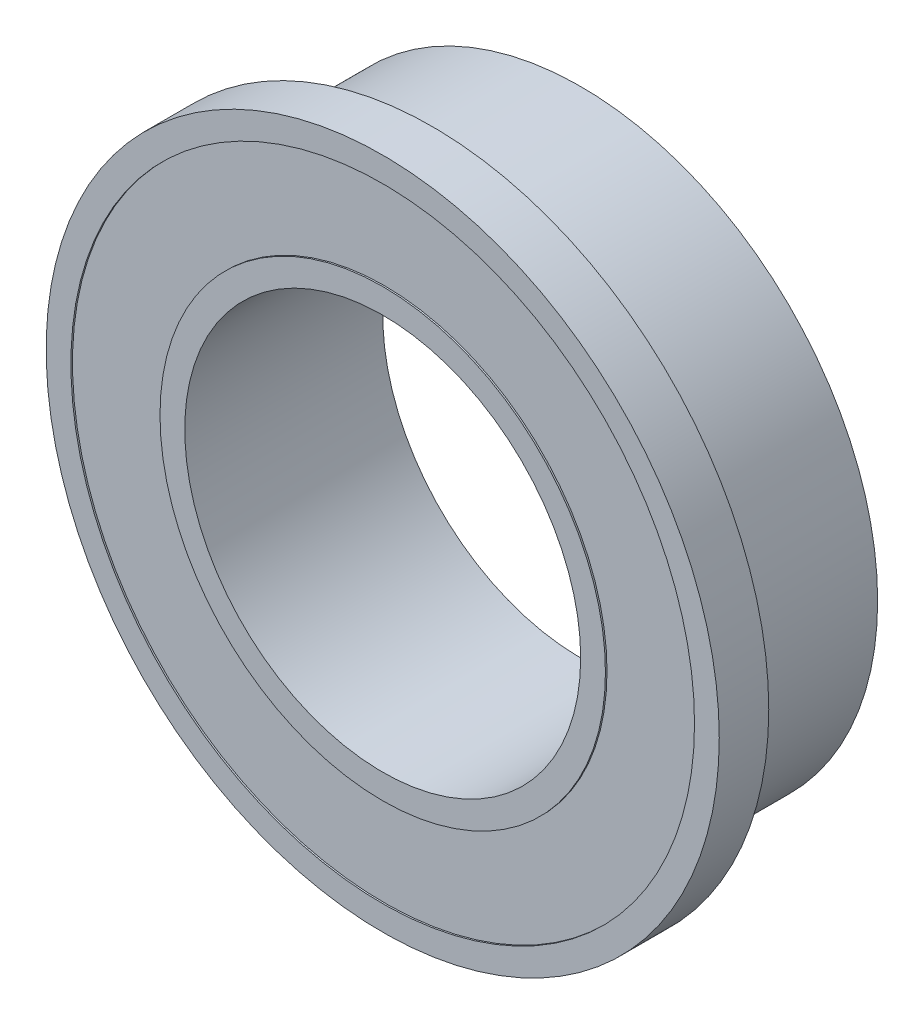
ISO-10303-21;
HEADER;
FILE_DESCRIPTION(('STEP AP214'),'2;1');
FILE_NAME('part.step','',(''),(''),'','','');
FILE_SCHEMA(('AUTOMOTIVE_DESIGN { 1 0 10303 214 1 1 1 1 }'));
ENDSEC;
DATA;
#1=APPLICATION_CONTEXT('core data for automotive mechanical design processes');
#2=APPLICATION_PROTOCOL_DEFINITION('international standard','automotive_design',2000,#1);
#3=PRODUCT_CONTEXT('',#1,'mechanical');
#4=PRODUCT('Part','Part','',(#3));
#5=PRODUCT_RELATED_PRODUCT_CATEGORY('part','',(#4));
#6=PRODUCT_DEFINITION_FORMATION('','',#4);
#7=PRODUCT_DEFINITION_CONTEXT('part definition',#1,'design');
#8=PRODUCT_DEFINITION('design','',#6,#7);
#9=PRODUCT_DEFINITION_SHAPE('','',#8);
#10=(LENGTH_UNIT() NAMED_UNIT(*) SI_UNIT(.MILLI.,.METRE.));
#11=(NAMED_UNIT(*) PLANE_ANGLE_UNIT() SI_UNIT($,.RADIAN.));
#12=(NAMED_UNIT(*) SI_UNIT($,.STERADIAN.) SOLID_ANGLE_UNIT());
#13=UNCERTAINTY_MEASURE_WITH_UNIT(LENGTH_MEASURE(1.E-05),#10,'distance_accuracy_value','');
#14=(GEOMETRIC_REPRESENTATION_CONTEXT(3) GLOBAL_UNCERTAINTY_ASSIGNED_CONTEXT((#13)) GLOBAL_UNIT_ASSIGNED_CONTEXT((#10,
#11,#12)) REPRESENTATION_CONTEXT('',''));
#15=CARTESIAN_POINT('',(0.,0.,0.));
#16=DIRECTION('',(0.,0.,1.));
#17=DIRECTION('',(1.,0.,0.));
#18=AXIS2_PLACEMENT_3D('',#15,#16,#17);
#19=CARTESIAN_POINT('',(0.,0.,0.));
#20=DIRECTION('',(0.,0.,1.));
#21=DIRECTION('',(1.,0.,0.));
#22=AXIS2_PLACEMENT_3D('',#19,#20,#21);
#23=PLANE('',#22);
#24=CARTESIAN_POINT('',(0.,0.,0.));
#25=DIRECTION('',(0.,0.,1.));
#26=DIRECTION('',(1.,0.,0.));
#27=AXIS2_PLACEMENT_3D('',#24,#25,#26);
#28=CIRCLE('',#27,3.175);
#29=CARTESIAN_POINT('',(3.175,0.,0.));
#30=VERTEX_POINT('',#29);
#31=EDGE_CURVE('E58',#30,#30,#28,.T.);
#32=ORIENTED_EDGE('',*,*,#31,.T.);
#33=EDGE_LOOP('',(#32));
#34=FACE_BOUND('',#33,.T.);
#35=CARTESIAN_POINT('',(0.,0.,0.));
#36=DIRECTION('',(0.,0.,-1.));
#37=DIRECTION('',(-1.,0.,0.));
#38=AXIS2_PLACEMENT_3D('',#35,#36,#37);
#39=CIRCLE('',#38,3.571875);
#40=CARTESIAN_POINT('',(-3.571875,0.,0.));
#41=VERTEX_POINT('',#40);
#42=EDGE_CURVE('E89',#41,#41,#39,.T.);
#43=ORIENTED_EDGE('',*,*,#42,.T.);
#44=EDGE_LOOP('',(#43));
#45=FACE_BOUND('',#44,.T.);
#46=ADVANCED_FACE('F44',(#34,#45),#23,.F.);
#47=CARTESIAN_POINT('',(0.,0.,3.175));
#48=DIRECTION('',(0.,0.,1.));
#49=DIRECTION('',(1.,0.,0.));
#50=AXIS2_PLACEMENT_3D('',#47,#48,#49);
#51=PLANE('',#50);
#52=CARTESIAN_POINT('',(0.,0.,3.175));
#53=DIRECTION('',(0.,0.,1.));
#54=DIRECTION('',(1.,0.,0.));
#55=AXIS2_PLACEMENT_3D('',#52,#53,#54);
#56=CIRCLE('',#55,3.175);
#57=CARTESIAN_POINT('',(3.175,0.,3.175));
#58=VERTEX_POINT('',#57);
#59=EDGE_CURVE('E57',#58,#58,#56,.T.);
#60=ORIENTED_EDGE('',*,*,#59,.F.);
#61=EDGE_LOOP('',(#60));
#62=FACE_BOUND('',#61,.T.);
#63=CARTESIAN_POINT('',(0.,0.,3.175));
#64=DIRECTION('',(0.,0.,1.));
#65=DIRECTION('',(1.,0.,0.));
#66=AXIS2_PLACEMENT_3D('',#63,#64,#65);
#67=CIRCLE('',#66,3.571875);
#68=CARTESIAN_POINT('',(3.571875,0.,3.175));
#69=VERTEX_POINT('',#68);
#70=EDGE_CURVE('E80',#69,#69,#67,.T.);
#71=ORIENTED_EDGE('',*,*,#70,.T.);
#72=EDGE_LOOP('',(#71));
#73=FACE_BOUND('',#72,.T.);
#74=ADVANCED_FACE('F130',(#62,#73),#51,.T.);
#75=CARTESIAN_POINT('',(0.,0.,3.175));
#76=DIRECTION('',(0.,0.,-1.));
#77=DIRECTION('',(-1.,0.,0.));
#78=AXIS2_PLACEMENT_3D('',#75,#76,#77);
#79=CYLINDRICAL_SURFACE('',#78,4.7625);
#80=CARTESIAN_POINT('',(0.,0.,0.));
#81=DIRECTION('',(0.,0.,1.));
#82=DIRECTION('',(1.,0.,0.));
#83=AXIS2_PLACEMENT_3D('',#80,#81,#82);
#84=CIRCLE('',#83,4.7625);
#85=CARTESIAN_POINT('',(4.7625,0.,0.));
#86=VERTEX_POINT('',#85);
#87=EDGE_CURVE('E55',#86,#86,#84,.T.);
#88=ORIENTED_EDGE('',*,*,#87,.T.);
#89=EDGE_LOOP('',(#88));
#90=FACE_BOUND('',#89,.T.);
#91=CARTESIAN_POINT('',(0.,0.,2.38125));
#92=DIRECTION('',(0.,0.,1.));
#93=DIRECTION('',(1.,0.,0.));
#94=AXIS2_PLACEMENT_3D('',#91,#92,#93);
#95=CIRCLE('',#94,4.7625);
#96=CARTESIAN_POINT('',(4.7625,0.,2.38125));
#97=VERTEX_POINT('',#96);
#98=EDGE_CURVE('E10',#97,#97,#95,.T.);
#99=ORIENTED_EDGE('',*,*,#98,.F.);
#100=EDGE_LOOP('',(#99));
#101=FACE_BOUND('',#100,.T.);
#102=ADVANCED_FACE('F50',(#90,#101),#79,.T.);
#103=CARTESIAN_POINT('',(0.,0.,3.175));
#104=DIRECTION('',(0.,0.,1.));
#105=DIRECTION('',(1.,0.,0.));
#106=AXIS2_PLACEMENT_3D('',#103,#104,#105);
#107=CIRCLE('',#106,5.000625);
#108=CARTESIAN_POINT('',(5.000625,0.,3.175));
#109=VERTEX_POINT('',#108);
#110=EDGE_CURVE('E75',#109,#109,#107,.T.);
#111=ORIENTED_EDGE('',*,*,#110,.F.);
#112=EDGE_LOOP('',(#111));
#113=FACE_BOUND('',#112,.T.);
#114=CARTESIAN_POINT('',(0.,0.,3.175));
#115=DIRECTION('',(0.,0.,1.));
#116=DIRECTION('',(1.,0.,0.));
#117=AXIS2_PLACEMENT_3D('',#114,#115,#116);
#118=CIRCLE('',#117,5.3975);
#119=CARTESIAN_POINT('',(5.3975,0.,3.175));
#120=VERTEX_POINT('',#119);
#121=EDGE_CURVE('E67',#120,#120,#118,.T.);
#122=ORIENTED_EDGE('',*,*,#121,.T.);
#123=EDGE_LOOP('',(#122));
#124=FACE_BOUND('',#123,.T.);
#125=ADVANCED_FACE('F119',(#113,#124),#51,.T.);
#126=CARTESIAN_POINT('',(0.,0.,0.));
#127=DIRECTION('',(0.,0.,-1.));
#128=DIRECTION('',(-1.,0.,0.));
#129=AXIS2_PLACEMENT_3D('',#126,#127,#128);
#130=CIRCLE('',#129,4.365625);
#131=CARTESIAN_POINT('',(-4.365625,0.,0.));
#132=VERTEX_POINT('',#131);
#133=EDGE_CURVE('E81',#132,#132,#130,.T.);
#134=ORIENTED_EDGE('',*,*,#133,.F.);
#135=EDGE_LOOP('',(#134));
#136=FACE_BOUND('',#135,.T.);
#137=ORIENTED_EDGE('',*,*,#87,.F.);
#138=EDGE_LOOP('',(#137));
#139=FACE_BOUND('',#138,.T.);
#140=ADVANCED_FACE('F115',(#136,#139),#23,.F.);
#141=CARTESIAN_POINT('',(0.,0.,3.175));
#142=DIRECTION('',(0.,0.,-1.));
#143=DIRECTION('',(-1.,0.,0.));
#144=AXIS2_PLACEMENT_3D('',#141,#142,#143);
#145=CYLINDRICAL_SURFACE('',#144,3.175);
#146=ORIENTED_EDGE('',*,*,#59,.T.);
#147=EDGE_LOOP('',(#146));
#148=FACE_BOUND('',#147,.T.);
#149=ORIENTED_EDGE('',*,*,#31,.F.);
#150=EDGE_LOOP('',(#149));
#151=FACE_BOUND('',#150,.T.);
#152=ADVANCED_FACE('F113',(#148,#151),#145,.F.);
#153=CARTESIAN_POINT('',(0.,0.,2.38125));
#154=DIRECTION('',(0.,0.,1.));
#155=DIRECTION('',(1.,0.,0.));
#156=AXIS2_PLACEMENT_3D('',#153,#154,#155);
#157=CYLINDRICAL_SURFACE('',#156,5.3975);
#158=CARTESIAN_POINT('',(0.,0.,2.38125));
#159=DIRECTION('',(0.,0.,1.));
#160=DIRECTION('',(1.,0.,0.));
#161=AXIS2_PLACEMENT_3D('',#158,#159,#160);
#162=CIRCLE('',#161,5.3975);
#163=CARTESIAN_POINT('',(5.3975,0.,2.38125));
#164=VERTEX_POINT('',#163);
#165=EDGE_CURVE('E63',#164,#164,#162,.T.);
#166=ORIENTED_EDGE('',*,*,#165,.T.);
#167=EDGE_LOOP('',(#166));
#168=FACE_BOUND('',#167,.T.);
#169=ORIENTED_EDGE('',*,*,#121,.F.);
#170=EDGE_LOOP('',(#169));
#171=FACE_BOUND('',#170,.T.);
#172=ADVANCED_FACE('F122',(#168,#171),#157,.T.);
#173=CARTESIAN_POINT('',(0.,0.,2.38125));
#174=DIRECTION('',(0.,0.,1.));
#175=DIRECTION('',(1.,0.,0.));
#176=AXIS2_PLACEMENT_3D('',#173,#174,#175);
#177=PLANE('',#176);
#178=ORIENTED_EDGE('',*,*,#98,.T.);
#179=EDGE_LOOP('',(#178));
#180=FACE_BOUND('',#179,.T.);
#181=ORIENTED_EDGE('',*,*,#165,.F.);
#182=EDGE_LOOP('',(#181));
#183=FACE_BOUND('',#182,.T.);
#184=ADVANCED_FACE('F155',(#180,#183),#177,.F.);
#185=CARTESIAN_POINT('',(0.,0.,3.1496));
#186=DIRECTION('',(0.,0.,1.));
#187=DIRECTION('',(1.,0.,0.));
#188=AXIS2_PLACEMENT_3D('',#185,#186,#187);
#189=CYLINDRICAL_SURFACE('',#188,5.000625);
#190=CARTESIAN_POINT('',(0.,0.,3.1496));
#191=DIRECTION('',(0.,0.,1.));
#192=DIRECTION('',(1.,0.,0.));
#193=AXIS2_PLACEMENT_3D('',#190,#191,#192);
#194=CIRCLE('',#193,5.000625);
#195=CARTESIAN_POINT('',(5.000625,0.,3.1496));
#196=VERTEX_POINT('',#195);
#197=EDGE_CURVE('E66',#196,#196,#194,.T.);
#198=ORIENTED_EDGE('',*,*,#197,.F.);
#199=EDGE_LOOP('',(#198));
#200=FACE_BOUND('',#199,.T.);
#201=ORIENTED_EDGE('',*,*,#110,.T.);
#202=EDGE_LOOP('',(#201));
#203=FACE_BOUND('',#202,.T.);
#204=ADVANCED_FACE('F146',(#200,#203),#189,.F.);
#205=CARTESIAN_POINT('',(0.,0.,3.1496));
#206=DIRECTION('',(0.,0.,1.));
#207=DIRECTION('',(1.,0.,0.));
#208=AXIS2_PLACEMENT_3D('',#205,#206,#207);
#209=PLANE('',#208);
#210=CARTESIAN_POINT('',(0.,0.,3.1496));
#211=DIRECTION('',(0.,0.,1.));
#212=DIRECTION('',(1.,0.,0.));
#213=AXIS2_PLACEMENT_3D('',#210,#211,#212);
#214=CIRCLE('',#213,3.571875);
#215=CARTESIAN_POINT('',(3.571875,0.,3.1496));
#216=VERTEX_POINT('',#215);
#217=EDGE_CURVE('E73',#216,#216,#214,.T.);
#218=ORIENTED_EDGE('',*,*,#217,.F.);
#219=EDGE_LOOP('',(#218));
#220=FACE_BOUND('',#219,.T.);
#221=ORIENTED_EDGE('',*,*,#197,.T.);
#222=EDGE_LOOP('',(#221));
#223=FACE_BOUND('',#222,.T.);
#224=ADVANCED_FACE('F145',(#220,#223),#209,.T.);
#225=CARTESIAN_POINT('',(0.,0.,3.1496));
#226=DIRECTION('',(0.,0.,1.));
#227=DIRECTION('',(1.,0.,0.));
#228=AXIS2_PLACEMENT_3D('',#225,#226,#227);
#229=CYLINDRICAL_SURFACE('',#228,3.571875);
#230=ORIENTED_EDGE('',*,*,#217,.T.);
#231=EDGE_LOOP('',(#230));
#232=FACE_BOUND('',#231,.T.);
#233=ORIENTED_EDGE('',*,*,#70,.F.);
#234=EDGE_LOOP('',(#233));
#235=FACE_BOUND('',#234,.T.);
#236=ADVANCED_FACE('F107',(#232,#235),#229,.T.);
#237=CARTESIAN_POINT('',(0.,0.,0.0254));
#238=DIRECTION('',(0.,0.,-1.));
#239=DIRECTION('',(-1.,0.,0.));
#240=AXIS2_PLACEMENT_3D('',#237,#238,#239);
#241=CYLINDRICAL_SURFACE('',#240,4.365625);
#242=CARTESIAN_POINT('',(0.,0.,0.0254));
#243=DIRECTION('',(0.,0.,-1.));
#244=DIRECTION('',(-1.,0.,0.));
#245=AXIS2_PLACEMENT_3D('',#242,#243,#244);
#246=CIRCLE('',#245,4.365625);
#247=CARTESIAN_POINT('',(-4.365625,0.,0.0254));
#248=VERTEX_POINT('',#247);
#249=EDGE_CURVE('E82',#248,#248,#246,.T.);
#250=ORIENTED_EDGE('',*,*,#249,.F.);
#251=EDGE_LOOP('',(#250));
#252=FACE_BOUND('',#251,.T.);
#253=ORIENTED_EDGE('',*,*,#133,.T.);
#254=EDGE_LOOP('',(#253));
#255=FACE_BOUND('',#254,.T.);
#256=ADVANCED_FACE('F105',(#252,#255),#241,.F.);
#257=CARTESIAN_POINT('',(0.,0.,0.0254));
#258=DIRECTION('',(0.,0.,-1.));
#259=DIRECTION('',(-1.,0.,0.));
#260=AXIS2_PLACEMENT_3D('',#257,#258,#259);
#261=PLANE('',#260);
#262=CARTESIAN_POINT('',(0.,0.,0.0254));
#263=DIRECTION('',(0.,0.,-1.));
#264=DIRECTION('',(-1.,0.,0.));
#265=AXIS2_PLACEMENT_3D('',#262,#263,#264);
#266=CIRCLE('',#265,3.571875);
#267=CARTESIAN_POINT('',(-3.571875,0.,0.0254));
#268=VERTEX_POINT('',#267);
#269=EDGE_CURVE('E87',#268,#268,#266,.T.);
#270=ORIENTED_EDGE('',*,*,#269,.F.);
#271=EDGE_LOOP('',(#270));
#272=FACE_BOUND('',#271,.T.);
#273=ORIENTED_EDGE('',*,*,#249,.T.);
#274=EDGE_LOOP('',(#273));
#275=FACE_BOUND('',#274,.T.);
#276=ADVANCED_FACE('F97',(#272,#275),#261,.T.);
#277=CARTESIAN_POINT('',(0.,0.,0.0254));
#278=DIRECTION('',(0.,0.,-1.));
#279=DIRECTION('',(-1.,0.,0.));
#280=AXIS2_PLACEMENT_3D('',#277,#278,#279);
#281=CYLINDRICAL_SURFACE('',#280,3.571875);
#282=ORIENTED_EDGE('',*,*,#269,.T.);
#283=EDGE_LOOP('',(#282));
#284=FACE_BOUND('',#283,.T.);
#285=ORIENTED_EDGE('',*,*,#42,.F.);
#286=EDGE_LOOP('',(#285));
#287=FACE_BOUND('',#286,.T.);
#288=ADVANCED_FACE('F96',(#284,#287),#281,.T.);
#289=CLOSED_SHELL('',(#46,#74,#102,#125,#140,#152,#172,#184,#204,#224,#236,#256,#276,#288));
#290=MANIFOLD_SOLID_BREP('B2',#289);
#291=ADVANCED_BREP_SHAPE_REPRESENTATION('',(#18,#290),#14);
#292=SHAPE_DEFINITION_REPRESENTATION(#9,#291);
ENDSEC;
END-ISO-10303-21;
